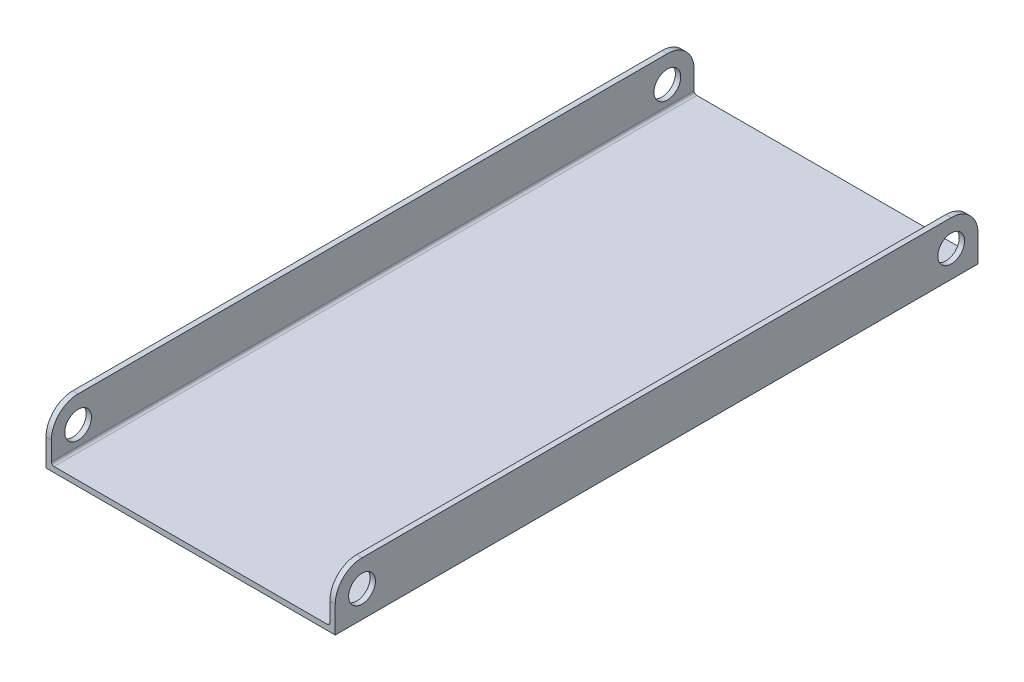
ISO-10303-21;
HEADER;
FILE_DESCRIPTION(('STEP AP214'),'2;1');
FILE_NAME('part.step','',(''),(''),'','','');
FILE_SCHEMA(('AUTOMOTIVE_DESIGN { 1 0 10303 214 1 1 1 1 }'));
ENDSEC;
DATA;
#1=APPLICATION_CONTEXT('core data for automotive mechanical design processes');
#2=APPLICATION_PROTOCOL_DEFINITION('international standard','automotive_design',2000,#1);
#3=PRODUCT_CONTEXT('',#1,'mechanical');
#4=PRODUCT('Part','Part','',(#3));
#5=PRODUCT_RELATED_PRODUCT_CATEGORY('part','',(#4));
#6=PRODUCT_DEFINITION_FORMATION('','',#4);
#7=PRODUCT_DEFINITION_CONTEXT('part definition',#1,'design');
#8=PRODUCT_DEFINITION('design','',#6,#7);
#9=PRODUCT_DEFINITION_SHAPE('','',#8);
#10=(LENGTH_UNIT() NAMED_UNIT(*) SI_UNIT(.MILLI.,.METRE.));
#11=(NAMED_UNIT(*) PLANE_ANGLE_UNIT() SI_UNIT($,.RADIAN.));
#12=(NAMED_UNIT(*) SI_UNIT($,.STERADIAN.) SOLID_ANGLE_UNIT());
#13=UNCERTAINTY_MEASURE_WITH_UNIT(LENGTH_MEASURE(1.E-05),#10,'distance_accuracy_value','');
#14=(GEOMETRIC_REPRESENTATION_CONTEXT(3) GLOBAL_UNCERTAINTY_ASSIGNED_CONTEXT((#13)) GLOBAL_UNIT_ASSIGNED_CONTEXT((#10,
#11,#12)) REPRESENTATION_CONTEXT('',''));
#15=CARTESIAN_POINT('',(0.,0.,0.));
#16=DIRECTION('',(0.,0.,1.));
#17=DIRECTION('',(1.,0.,0.));
#18=AXIS2_PLACEMENT_3D('',#15,#16,#17);
#19=CARTESIAN_POINT('',(0.,12.7,0.));
#20=DIRECTION('',(0.,-1.,0.));
#21=DIRECTION('',(0.,0.,-1.));
#22=AXIS2_PLACEMENT_3D('',#19,#20,#21);
#23=PLANE('',#22);
#24=DIRECTION('',(0.,0.,1.));
#25=VECTOR('',#24,1.);
#26=CARTESIAN_POINT('',(1.27,12.7,-152.4));
#27=LINE('',#26,#25);
#28=CARTESIAN_POINT('',(1.27,12.7,-146.05));
#29=VERTEX_POINT('',#28);
#30=CARTESIAN_POINT('',(1.27,12.7,-6.35000000000005));
#31=VERTEX_POINT('',#30);
#32=EDGE_CURVE('E178',#29,#31,#27,.T.);
#33=ORIENTED_EDGE('',*,*,#32,.F.);
#34=DIRECTION('',(-1.,0.,0.));
#35=VECTOR('',#34,1.);
#36=CARTESIAN_POINT('',(0.,12.7,-146.05));
#37=LINE('',#36,#35);
#38=CARTESIAN_POINT('',(0.,12.7,-146.05));
#39=VERTEX_POINT('',#38);
#40=EDGE_CURVE('E263',#29,#39,#37,.T.);
#41=ORIENTED_EDGE('',*,*,#40,.T.);
#42=DIRECTION('',(0.,0.,1.));
#43=VECTOR('',#42,1.);
#44=CARTESIAN_POINT('',(0.,12.7,0.));
#45=LINE('',#44,#43);
#46=CARTESIAN_POINT('',(0.,12.7,-6.35));
#47=VERTEX_POINT('',#46);
#48=EDGE_CURVE('E193',#39,#47,#45,.T.);
#49=ORIENTED_EDGE('',*,*,#48,.T.);
#50=DIRECTION('',(1.,0.,0.));
#51=VECTOR('',#50,1.);
#52=CARTESIAN_POINT('',(0.,12.7,-6.35));
#53=LINE('',#52,#51);
#54=EDGE_CURVE('E259',#47,#31,#53,.T.);
#55=ORIENTED_EDGE('',*,*,#54,.T.);
#56=EDGE_LOOP('',(#33,#41,#49,#55));
#57=FACE_BOUND('',#56,.T.);
#58=ADVANCED_FACE('F45',(#57),#23,.F.);
#59=CARTESIAN_POINT('',(0.,12.7,0.));
#60=DIRECTION('',(1.,0.,0.));
#61=DIRECTION('',(0.,0.,-1.));
#62=AXIS2_PLACEMENT_3D('',#59,#60,#61);
#63=PLANE('',#62);
#64=CARTESIAN_POINT('',(0.,6.35,-6.34999999999998));
#65=DIRECTION('',(1.,0.,0.));
#66=DIRECTION('',(0.,0.,-1.));
#67=AXIS2_PLACEMENT_3D('',#64,#65,#66);
#68=CIRCLE('',#67,3.175);
#69=CARTESIAN_POINT('',(0.,6.35,-9.52499999999998));
#70=VERTEX_POINT('',#69);
#71=EDGE_CURVE('E275',#70,#70,#68,.T.);
#72=ORIENTED_EDGE('',*,*,#71,.T.);
#73=EDGE_LOOP('',(#72));
#74=FACE_BOUND('',#73,.T.);
#75=CARTESIAN_POINT('',(0.,6.35,-146.05));
#76=DIRECTION('',(1.,0.,0.));
#77=DIRECTION('',(0.,0.,-1.));
#78=AXIS2_PLACEMENT_3D('',#75,#76,#77);
#79=CIRCLE('',#78,3.175);
#80=CARTESIAN_POINT('',(0.,6.35,-149.225));
#81=VERTEX_POINT('',#80);
#82=EDGE_CURVE('E295',#81,#81,#79,.T.);
#83=ORIENTED_EDGE('',*,*,#82,.T.);
#84=EDGE_LOOP('',(#83));
#85=FACE_BOUND('',#84,.T.);
#86=ORIENTED_EDGE('',*,*,#48,.F.);
#87=CARTESIAN_POINT('',(0.,6.35,-146.05));
#88=DIRECTION('',(1.,0.,0.));
#89=DIRECTION('',(0.,0.,-1.));
#90=AXIS2_PLACEMENT_3D('',#87,#88,#89);
#91=CIRCLE('',#90,6.35);
#92=CARTESIAN_POINT('',(0.,6.35,-152.4));
#93=VERTEX_POINT('',#92);
#94=EDGE_CURVE('E71',#39,#93,#91,.F.);
#95=ORIENTED_EDGE('',*,*,#94,.T.);
#96=DIRECTION('',(0.,-1.,0.));
#97=VECTOR('',#96,1.);
#98=CARTESIAN_POINT('',(0.,12.7,-152.4));
#99=LINE('',#98,#97);
#100=CARTESIAN_POINT('',(0.,0.,-152.4));
#101=VERTEX_POINT('',#100);
#102=EDGE_CURVE('E175',#93,#101,#99,.T.);
#103=ORIENTED_EDGE('',*,*,#102,.T.);
#104=DIRECTION('',(0.,0.,1.));
#105=VECTOR('',#104,1.);
#106=CARTESIAN_POINT('',(0.,0.,0.));
#107=LINE('',#106,#105);
#108=CARTESIAN_POINT('',(0.,0.,0.));
#109=VERTEX_POINT('',#108);
#110=EDGE_CURVE('E168',#101,#109,#107,.T.);
#111=ORIENTED_EDGE('',*,*,#110,.T.);
#112=DIRECTION('',(0.,-1.,0.));
#113=VECTOR('',#112,1.);
#114=CARTESIAN_POINT('',(0.,12.7,0.));
#115=LINE('',#114,#113);
#116=CARTESIAN_POINT('',(0.,6.35,0.));
#117=VERTEX_POINT('',#116);
#118=EDGE_CURVE('E150',#117,#109,#115,.T.);
#119=ORIENTED_EDGE('',*,*,#118,.F.);
#120=CARTESIAN_POINT('',(0.,6.35,-6.35));
#121=DIRECTION('',(1.,0.,0.));
#122=DIRECTION('',(0.,0.,-1.));
#123=AXIS2_PLACEMENT_3D('',#120,#121,#122);
#124=CIRCLE('',#123,6.35);
#125=EDGE_CURVE('E63',#117,#47,#124,.F.);
#126=ORIENTED_EDGE('',*,*,#125,.T.);
#127=EDGE_LOOP('',(#86,#95,#103,#111,#119,#126));
#128=FACE_BOUND('',#127,.T.);
#129=ADVANCED_FACE('F173',(#74,#85,#128),#63,.F.);
#130=CARTESIAN_POINT('',(0.,12.7,0.));
#131=DIRECTION('',(0.,0.,-1.));
#132=DIRECTION('',(-1.,0.,0.));
#133=AXIS2_PLACEMENT_3D('',#130,#131,#132);
#134=PLANE('',#133);
#135=DIRECTION('',(0.,-1.,0.));
#136=VECTOR('',#135,1.);
#137=CARTESIAN_POINT('',(68.58,12.7,0.));
#138=LINE('',#137,#136);
#139=CARTESIAN_POINT('',(68.58,6.35,0.));
#140=VERTEX_POINT('',#139);
#141=CARTESIAN_POINT('',(68.58,0.,0.));
#142=VERTEX_POINT('',#141);
#143=EDGE_CURVE('E162',#140,#142,#138,.T.);
#144=ORIENTED_EDGE('',*,*,#143,.F.);
#145=DIRECTION('',(1.,0.,0.));
#146=VECTOR('',#145,1.);
#147=CARTESIAN_POINT('',(0.,6.35,0.));
#148=LINE('',#147,#146);
#149=CARTESIAN_POINT('',(67.31,6.35,0.));
#150=VERTEX_POINT('',#149);
#151=EDGE_CURVE('E256',#140,#150,#148,.F.);
#152=ORIENTED_EDGE('',*,*,#151,.T.);
#153=DIRECTION('',(0.,1.,0.));
#154=VECTOR('',#153,1.);
#155=CARTESIAN_POINT('',(67.31,12.7,0.));
#156=LINE('',#155,#154);
#157=CARTESIAN_POINT('',(67.31,1.90500000000001,0.));
#158=VERTEX_POINT('',#157);
#159=EDGE_CURVE('E308',#158,#150,#156,.T.);
#160=ORIENTED_EDGE('',*,*,#159,.F.);
#161=CARTESIAN_POINT('',(66.675,1.90500000000001,0.));
#162=DIRECTION('',(0.,0.,-1.));
#163=DIRECTION('',(-1.,0.,0.));
#164=AXIS2_PLACEMENT_3D('',#161,#162,#163);
#165=CIRCLE('',#164,0.635);
#166=CARTESIAN_POINT('',(66.675,1.27000000000001,0.));
#167=VERTEX_POINT('',#166);
#168=EDGE_CURVE('E215',#158,#167,#165,.T.);
#169=ORIENTED_EDGE('',*,*,#168,.T.);
#170=DIRECTION('',(1.,0.,0.));
#171=VECTOR('',#170,1.);
#172=CARTESIAN_POINT('',(1.26999999999999,1.27,0.));
#173=LINE('',#172,#171);
#174=CARTESIAN_POINT('',(1.90499999999999,1.27,0.));
#175=VERTEX_POINT('',#174);
#176=EDGE_CURVE('E318',#175,#167,#173,.T.);
#177=ORIENTED_EDGE('',*,*,#176,.F.);
#178=CARTESIAN_POINT('',(1.90499999999999,1.905,0.));
#179=DIRECTION('',(0.,0.,-1.));
#180=DIRECTION('',(-1.,0.,0.));
#181=AXIS2_PLACEMENT_3D('',#178,#179,#180);
#182=CIRCLE('',#181,0.635);
#183=CARTESIAN_POINT('',(1.26999999999999,1.905,0.));
#184=VERTEX_POINT('',#183);
#185=EDGE_CURVE('E221',#175,#184,#182,.T.);
#186=ORIENTED_EDGE('',*,*,#185,.T.);
#187=DIRECTION('',(0.,-1.,0.));
#188=VECTOR('',#187,1.);
#189=CARTESIAN_POINT('',(1.27,12.7,0.));
#190=LINE('',#189,#188);
#191=CARTESIAN_POINT('',(1.27,6.35,0.));
#192=VERTEX_POINT('',#191);
#193=EDGE_CURVE('E303',#192,#184,#190,.T.);
#194=ORIENTED_EDGE('',*,*,#193,.F.);
#195=DIRECTION('',(1.,0.,0.));
#196=VECTOR('',#195,1.);
#197=CARTESIAN_POINT('',(0.,6.35,0.));
#198=LINE('',#197,#196);
#199=EDGE_CURVE('E158',#192,#117,#198,.F.);
#200=ORIENTED_EDGE('',*,*,#199,.T.);
#201=ORIENTED_EDGE('',*,*,#118,.T.);
#202=DIRECTION('',(1.,0.,0.));
#203=VECTOR('',#202,1.);
#204=CARTESIAN_POINT('',(0.,0.,0.));
#205=LINE('',#204,#203);
#206=EDGE_CURVE('E154',#109,#142,#205,.T.);
#207=ORIENTED_EDGE('',*,*,#206,.T.);
#208=EDGE_LOOP('',(#144,#152,#160,#169,#177,#186,#194,#200,#201,#207));
#209=FACE_BOUND('',#208,.T.);
#210=ADVANCED_FACE('F153',(#209),#134,.F.);
#211=CARTESIAN_POINT('',(68.58,12.7,0.));
#212=DIRECTION('',(-1.,0.,0.));
#213=DIRECTION('',(0.,0.,1.));
#214=AXIS2_PLACEMENT_3D('',#211,#212,#213);
#215=PLANE('',#214);
#216=CARTESIAN_POINT('',(68.58,6.35,-6.35));
#217=DIRECTION('',(1.,0.,0.));
#218=DIRECTION('',(0.,0.,-1.));
#219=AXIS2_PLACEMENT_3D('',#216,#217,#218);
#220=CIRCLE('',#219,3.175);
#221=CARTESIAN_POINT('',(68.58,6.35,-9.525));
#222=VERTEX_POINT('',#221);
#223=EDGE_CURVE('E283',#222,#222,#220,.T.);
#224=ORIENTED_EDGE('',*,*,#223,.F.);
#225=EDGE_LOOP('',(#224));
#226=FACE_BOUND('',#225,.T.);
#227=CARTESIAN_POINT('',(68.58,6.35,-146.05));
#228=DIRECTION('',(1.,0.,0.));
#229=DIRECTION('',(0.,0.,-1.));
#230=AXIS2_PLACEMENT_3D('',#227,#228,#229);
#231=CIRCLE('',#230,3.175);
#232=CARTESIAN_POINT('',(68.58,6.35,-149.225));
#233=VERTEX_POINT('',#232);
#234=EDGE_CURVE('E289',#233,#233,#231,.T.);
#235=ORIENTED_EDGE('',*,*,#234,.F.);
#236=EDGE_LOOP('',(#235));
#237=FACE_BOUND('',#236,.T.);
#238=DIRECTION('',(0.,-1.,0.));
#239=VECTOR('',#238,1.);
#240=CARTESIAN_POINT('',(68.58,12.7,-152.4));
#241=LINE('',#240,#239);
#242=CARTESIAN_POINT('',(68.58,6.35,-152.4));
#243=VERTEX_POINT('',#242);
#244=CARTESIAN_POINT('',(68.58,0.,-152.4));
#245=VERTEX_POINT('',#244);
#246=EDGE_CURVE('E196',#243,#245,#241,.T.);
#247=ORIENTED_EDGE('',*,*,#246,.F.);
#248=CARTESIAN_POINT('',(68.58,6.35,-146.05));
#249=DIRECTION('',(-1.,0.,0.));
#250=DIRECTION('',(0.,0.,1.));
#251=AXIS2_PLACEMENT_3D('',#248,#249,#250);
#252=CIRCLE('',#251,6.35);
#253=CARTESIAN_POINT('',(68.58,12.7,-146.05));
#254=VERTEX_POINT('',#253);
#255=EDGE_CURVE('E251',#243,#254,#252,.F.);
#256=ORIENTED_EDGE('',*,*,#255,.T.);
#257=DIRECTION('',(0.,0.,-1.));
#258=VECTOR('',#257,1.);
#259=CARTESIAN_POINT('',(68.58,12.7,0.));
#260=LINE('',#259,#258);
#261=CARTESIAN_POINT('',(68.58,12.7,-6.35));
#262=VERTEX_POINT('',#261);
#263=EDGE_CURVE('E185',#262,#254,#260,.T.);
#264=ORIENTED_EDGE('',*,*,#263,.F.);
#265=CARTESIAN_POINT('',(68.58,6.35,-6.35));
#266=DIRECTION('',(-1.,0.,0.));
#267=DIRECTION('',(0.,0.,1.));
#268=AXIS2_PLACEMENT_3D('',#265,#266,#267);
#269=CIRCLE('',#268,6.35);
#270=EDGE_CURVE('E248',#262,#140,#269,.F.);
#271=ORIENTED_EDGE('',*,*,#270,.T.);
#272=ORIENTED_EDGE('',*,*,#143,.T.);
#273=DIRECTION('',(0.,0.,-1.));
#274=VECTOR('',#273,1.);
#275=CARTESIAN_POINT('',(68.58,0.,0.));
#276=LINE('',#275,#274);
#277=EDGE_CURVE('E170',#142,#245,#276,.T.);
#278=ORIENTED_EDGE('',*,*,#277,.T.);
#279=EDGE_LOOP('',(#247,#256,#264,#271,#272,#278));
#280=FACE_BOUND('',#279,.T.);
#281=ADVANCED_FACE('F361',(#226,#237,#280),#215,.F.);
#282=CARTESIAN_POINT('',(0.,12.7,-152.4));
#283=DIRECTION('',(0.,0.,1.));
#284=DIRECTION('',(1.,0.,0.));
#285=AXIS2_PLACEMENT_3D('',#282,#283,#284);
#286=PLANE('',#285);
#287=DIRECTION('',(0.,1.,0.));
#288=VECTOR('',#287,1.);
#289=CARTESIAN_POINT('',(67.31,12.7,-152.4));
#290=LINE('',#289,#288);
#291=CARTESIAN_POINT('',(67.31,1.90500000000001,-152.4));
#292=VERTEX_POINT('',#291);
#293=CARTESIAN_POINT('',(67.31,6.35,-152.4));
#294=VERTEX_POINT('',#293);
#295=EDGE_CURVE('E312',#292,#294,#290,.T.);
#296=ORIENTED_EDGE('',*,*,#295,.T.);
#297=DIRECTION('',(-1.,0.,0.));
#298=VECTOR('',#297,1.);
#299=CARTESIAN_POINT('',(0.,6.35,-152.4));
#300=LINE('',#299,#298);
#301=EDGE_CURVE('E245',#294,#243,#300,.F.);
#302=ORIENTED_EDGE('',*,*,#301,.T.);
#303=ORIENTED_EDGE('',*,*,#246,.T.);
#304=DIRECTION('',(-1.,0.,0.));
#305=VECTOR('',#304,1.);
#306=CARTESIAN_POINT('',(0.,0.,-152.4));
#307=LINE('',#306,#305);
#308=EDGE_CURVE('E190',#245,#101,#307,.T.);
#309=ORIENTED_EDGE('',*,*,#308,.T.);
#310=ORIENTED_EDGE('',*,*,#102,.F.);
#311=DIRECTION('',(-1.,0.,0.));
#312=VECTOR('',#311,1.);
#313=CARTESIAN_POINT('',(0.,6.35,-152.4));
#314=LINE('',#313,#312);
#315=CARTESIAN_POINT('',(1.27,6.35,-152.4));
#316=VERTEX_POINT('',#315);
#317=EDGE_CURVE('E242',#93,#316,#314,.F.);
#318=ORIENTED_EDGE('',*,*,#317,.T.);
#319=DIRECTION('',(0.,-1.,0.));
#320=VECTOR('',#319,1.);
#321=CARTESIAN_POINT('',(1.27,12.7,-152.4));
#322=LINE('',#321,#320);
#323=CARTESIAN_POINT('',(1.26999999999999,1.905,-152.4));
#324=VERTEX_POINT('',#323);
#325=EDGE_CURVE('E304',#316,#324,#322,.T.);
#326=ORIENTED_EDGE('',*,*,#325,.T.);
#327=CARTESIAN_POINT('',(1.90499999999999,1.905,-152.4));
#328=DIRECTION('',(0.,0.,1.));
#329=DIRECTION('',(1.,0.,0.));
#330=AXIS2_PLACEMENT_3D('',#327,#328,#329);
#331=CIRCLE('',#330,0.635);
#332=CARTESIAN_POINT('',(1.90499999999999,1.27,-152.4));
#333=VERTEX_POINT('',#332);
#334=EDGE_CURVE('E225',#324,#333,#331,.T.);
#335=ORIENTED_EDGE('',*,*,#334,.T.);
#336=DIRECTION('',(1.,0.,0.));
#337=VECTOR('',#336,1.);
#338=CARTESIAN_POINT('',(1.26999999999999,1.27,-152.4));
#339=LINE('',#338,#337);
#340=CARTESIAN_POINT('',(66.675,1.27000000000001,-152.4));
#341=VERTEX_POINT('',#340);
#342=EDGE_CURVE('E307',#333,#341,#339,.T.);
#343=ORIENTED_EDGE('',*,*,#342,.T.);
#344=CARTESIAN_POINT('',(66.675,1.90500000000001,-152.4));
#345=DIRECTION('',(0.,0.,1.));
#346=DIRECTION('',(1.,0.,0.));
#347=AXIS2_PLACEMENT_3D('',#344,#345,#346);
#348=CIRCLE('',#347,0.635);
#349=EDGE_CURVE('E218',#341,#292,#348,.T.);
#350=ORIENTED_EDGE('',*,*,#349,.T.);
#351=EDGE_LOOP('',(#296,#302,#303,#309,#310,#318,#326,#335,#343,#350));
#352=FACE_BOUND('',#351,.T.);
#353=ADVANCED_FACE('F348',(#352),#286,.F.);
#354=ORIENTED_EDGE('',*,*,#263,.T.);
#355=DIRECTION('',(-1.,0.,0.));
#356=VECTOR('',#355,1.);
#357=CARTESIAN_POINT('',(0.,12.7,-146.05));
#358=LINE('',#357,#356);
#359=CARTESIAN_POINT('',(67.31,12.7,-146.05));
#360=VERTEX_POINT('',#359);
#361=EDGE_CURVE('E232',#254,#360,#358,.T.);
#362=ORIENTED_EDGE('',*,*,#361,.T.);
#363=DIRECTION('',(0.,0.,1.));
#364=VECTOR('',#363,1.);
#365=CARTESIAN_POINT('',(67.31,12.7,-152.4));
#366=LINE('',#365,#364);
#367=CARTESIAN_POINT('',(67.31,12.7,-6.35000000000005));
#368=VERTEX_POINT('',#367);
#369=EDGE_CURVE('E182',#360,#368,#366,.T.);
#370=ORIENTED_EDGE('',*,*,#369,.T.);
#371=DIRECTION('',(1.,0.,0.));
#372=VECTOR('',#371,1.);
#373=CARTESIAN_POINT('',(0.,12.7,-6.35));
#374=LINE('',#373,#372);
#375=EDGE_CURVE('E228',#368,#262,#374,.T.);
#376=ORIENTED_EDGE('',*,*,#375,.T.);
#377=EDGE_LOOP('',(#354,#362,#370,#376));
#378=FACE_BOUND('',#377,.T.);
#379=ADVANCED_FACE('F335',(#378),#23,.F.);
#380=CARTESIAN_POINT('',(0.,0.,0.));
#381=DIRECTION('',(0.,-1.,0.));
#382=DIRECTION('',(0.,0.,-1.));
#383=AXIS2_PLACEMENT_3D('',#380,#381,#382);
#384=PLANE('',#383);
#385=ORIENTED_EDGE('',*,*,#110,.F.);
#386=ORIENTED_EDGE('',*,*,#308,.F.);
#387=ORIENTED_EDGE('',*,*,#277,.F.);
#388=ORIENTED_EDGE('',*,*,#206,.F.);
#389=EDGE_LOOP('',(#385,#386,#387,#388));
#390=FACE_BOUND('',#389,.T.);
#391=ADVANCED_FACE('F166',(#390),#384,.T.);
#392=CARTESIAN_POINT('',(1.27,12.7,-152.4));
#393=DIRECTION('',(-1.,0.,0.));
#394=DIRECTION('',(0.,-1.,0.));
#395=AXIS2_PLACEMENT_3D('',#392,#393,#394);
#396=PLANE('',#395);
#397=CARTESIAN_POINT('',(1.27,6.35,-6.34999999999998));
#398=DIRECTION('',(-1.,0.,0.));
#399=DIRECTION('',(0.,-1.,0.));
#400=AXIS2_PLACEMENT_3D('',#397,#398,#399);
#401=CIRCLE('',#400,3.175);
#402=CARTESIAN_POINT('',(1.27,3.175,-6.34999999999998));
#403=VERTEX_POINT('',#402);
#404=EDGE_CURVE('E299',#403,#403,#401,.T.);
#405=ORIENTED_EDGE('',*,*,#404,.T.);
#406=EDGE_LOOP('',(#405));
#407=FACE_BOUND('',#406,.T.);
#408=CARTESIAN_POINT('',(1.27,6.35,-146.05));
#409=DIRECTION('',(-1.,0.,0.));
#410=DIRECTION('',(0.,-1.,0.));
#411=AXIS2_PLACEMENT_3D('',#408,#409,#410);
#412=CIRCLE('',#411,3.175);
#413=CARTESIAN_POINT('',(1.27,3.175,-146.05));
#414=VERTEX_POINT('',#413);
#415=EDGE_CURVE('E274',#414,#414,#412,.T.);
#416=ORIENTED_EDGE('',*,*,#415,.T.);
#417=EDGE_LOOP('',(#416));
#418=FACE_BOUND('',#417,.T.);
#419=ORIENTED_EDGE('',*,*,#325,.F.);
#420=CARTESIAN_POINT('',(1.27,6.35,-146.05));
#421=DIRECTION('',(-1.,0.,0.));
#422=DIRECTION('',(0.,-1.,0.));
#423=AXIS2_PLACEMENT_3D('',#420,#421,#422);
#424=CIRCLE('',#423,6.35);
#425=EDGE_CURVE('E11',#316,#29,#424,.F.);
#426=ORIENTED_EDGE('',*,*,#425,.T.);
#427=ORIENTED_EDGE('',*,*,#32,.T.);
#428=CARTESIAN_POINT('',(1.27,6.35,-6.35));
#429=DIRECTION('',(-1.,0.,0.));
#430=DIRECTION('',(0.,-1.,0.));
#431=AXIS2_PLACEMENT_3D('',#428,#429,#430);
#432=CIRCLE('',#431,6.35);
#433=EDGE_CURVE('E55',#31,#192,#432,.F.);
#434=ORIENTED_EDGE('',*,*,#433,.T.);
#435=ORIENTED_EDGE('',*,*,#193,.T.);
#436=DIRECTION('',(0.,0.,1.));
#437=VECTOR('',#436,1.);
#438=CARTESIAN_POINT('',(1.26999999999999,1.905,-152.4));
#439=LINE('',#438,#437);
#440=EDGE_CURVE('E211',#184,#324,#439,.F.);
#441=ORIENTED_EDGE('',*,*,#440,.T.);
#442=EDGE_LOOP('',(#419,#426,#427,#434,#435,#441));
#443=FACE_BOUND('',#442,.T.);
#444=ADVANCED_FACE('F367',(#407,#418,#443),#396,.F.);
#445=CARTESIAN_POINT('',(67.31,12.7,-152.4));
#446=DIRECTION('',(1.,0.,0.));
#447=DIRECTION('',(0.,1.,0.));
#448=AXIS2_PLACEMENT_3D('',#445,#446,#447);
#449=PLANE('',#448);
#450=CARTESIAN_POINT('',(67.31,6.35,-6.35));
#451=DIRECTION('',(1.,0.,0.));
#452=DIRECTION('',(0.,1.,0.));
#453=AXIS2_PLACEMENT_3D('',#450,#451,#452);
#454=CIRCLE('',#453,3.175);
#455=CARTESIAN_POINT('',(67.31,9.525,-6.35));
#456=VERTEX_POINT('',#455);
#457=EDGE_CURVE('E49',#456,#456,#454,.T.);
#458=ORIENTED_EDGE('',*,*,#457,.T.);
#459=EDGE_LOOP('',(#458));
#460=FACE_BOUND('',#459,.T.);
#461=CARTESIAN_POINT('',(67.31,6.35,-146.05));
#462=DIRECTION('',(1.,0.,0.));
#463=DIRECTION('',(0.,1.,0.));
#464=AXIS2_PLACEMENT_3D('',#461,#462,#463);
#465=CIRCLE('',#464,3.175);
#466=CARTESIAN_POINT('',(67.31,9.525,-146.05));
#467=VERTEX_POINT('',#466);
#468=EDGE_CURVE('E271',#467,#467,#465,.T.);
#469=ORIENTED_EDGE('',*,*,#468,.T.);
#470=EDGE_LOOP('',(#469));
#471=FACE_BOUND('',#470,.T.);
#472=ORIENTED_EDGE('',*,*,#369,.F.);
#473=CARTESIAN_POINT('',(67.31,6.35,-146.05));
#474=DIRECTION('',(1.,0.,0.));
#475=DIRECTION('',(0.,1.,0.));
#476=AXIS2_PLACEMENT_3D('',#473,#474,#475);
#477=CIRCLE('',#476,6.35);
#478=EDGE_CURVE('E239',#360,#294,#477,.F.);
#479=ORIENTED_EDGE('',*,*,#478,.T.);
#480=ORIENTED_EDGE('',*,*,#295,.F.);
#481=DIRECTION('',(0.,0.,1.));
#482=VECTOR('',#481,1.);
#483=CARTESIAN_POINT('',(67.31,1.90500000000001,0.));
#484=LINE('',#483,#482);
#485=EDGE_CURVE('E161',#292,#158,#484,.T.);
#486=ORIENTED_EDGE('',*,*,#485,.T.);
#487=ORIENTED_EDGE('',*,*,#159,.T.);
#488=CARTESIAN_POINT('',(67.31,6.35,-6.35));
#489=DIRECTION('',(1.,0.,0.));
#490=DIRECTION('',(0.,1.,0.));
#491=AXIS2_PLACEMENT_3D('',#488,#489,#490);
#492=CIRCLE('',#491,6.35);
#493=EDGE_CURVE('E236',#150,#368,#492,.F.);
#494=ORIENTED_EDGE('',*,*,#493,.T.);
#495=EDGE_LOOP('',(#472,#479,#480,#486,#487,#494));
#496=FACE_BOUND('',#495,.T.);
#497=ADVANCED_FACE('F345',(#460,#471,#496),#449,.F.);
#498=CARTESIAN_POINT('',(1.26999999999999,1.27,-152.4));
#499=DIRECTION('',(0.,-1.,0.));
#500=DIRECTION('',(1.,0.,0.));
#501=AXIS2_PLACEMENT_3D('',#498,#499,#500);
#502=PLANE('',#501);
#503=ORIENTED_EDGE('',*,*,#176,.T.);
#504=DIRECTION('',(0.,0.,1.));
#505=VECTOR('',#504,1.);
#506=CARTESIAN_POINT('',(66.675,1.27000000000001,-152.4));
#507=LINE('',#506,#505);
#508=EDGE_CURVE('E208',#167,#341,#507,.F.);
#509=ORIENTED_EDGE('',*,*,#508,.T.);
#510=ORIENTED_EDGE('',*,*,#342,.F.);
#511=DIRECTION('',(0.,0.,1.));
#512=VECTOR('',#511,1.);
#513=CARTESIAN_POINT('',(1.90499999999999,1.27,0.));
#514=LINE('',#513,#512);
#515=EDGE_CURVE('E204',#333,#175,#514,.T.);
#516=ORIENTED_EDGE('',*,*,#515,.T.);
#517=EDGE_LOOP('',(#503,#509,#510,#516));
#518=FACE_BOUND('',#517,.T.);
#519=ADVANCED_FACE('F375',(#518),#502,.F.);
#520=CARTESIAN_POINT('',(66.675,1.90500000000001,-152.4));
#521=DIRECTION('',(0.,0.,-1.));
#522=DIRECTION('',(-1.,0.,0.));
#523=AXIS2_PLACEMENT_3D('',#520,#521,#522);
#524=CYLINDRICAL_SURFACE('',#523,0.635);
#525=ORIENTED_EDGE('',*,*,#349,.F.);
#526=ORIENTED_EDGE('',*,*,#508,.F.);
#527=ORIENTED_EDGE('',*,*,#168,.F.);
#528=ORIENTED_EDGE('',*,*,#485,.F.);
#529=EDGE_LOOP('',(#525,#526,#527,#528));
#530=FACE_BOUND('',#529,.T.);
#531=ADVANCED_FACE('F354',(#530),#524,.F.);
#532=CARTESIAN_POINT('',(1.90499999999999,1.905,-152.4));
#533=DIRECTION('',(0.,0.,-1.));
#534=DIRECTION('',(-1.,0.,0.));
#535=AXIS2_PLACEMENT_3D('',#532,#533,#534);
#536=CYLINDRICAL_SURFACE('',#535,0.635);
#537=ORIENTED_EDGE('',*,*,#334,.F.);
#538=ORIENTED_EDGE('',*,*,#440,.F.);
#539=ORIENTED_EDGE('',*,*,#185,.F.);
#540=ORIENTED_EDGE('',*,*,#515,.F.);
#541=EDGE_LOOP('',(#537,#538,#539,#540));
#542=FACE_BOUND('',#541,.T.);
#543=ADVANCED_FACE('F373',(#542),#536,.F.);
#544=CARTESIAN_POINT('',(0.,6.35,-146.05));
#545=DIRECTION('',(-1.,0.,0.));
#546=DIRECTION('',(0.,0.,1.));
#547=AXIS2_PLACEMENT_3D('',#544,#545,#546);
#548=CYLINDRICAL_SURFACE('',#547,6.35);
#549=ORIENTED_EDGE('',*,*,#255,.F.);
#550=ORIENTED_EDGE('',*,*,#301,.F.);
#551=ORIENTED_EDGE('',*,*,#478,.F.);
#552=ORIENTED_EDGE('',*,*,#361,.F.);
#553=EDGE_LOOP('',(#549,#550,#551,#552));
#554=FACE_BOUND('',#553,.T.);
#555=ADVANCED_FACE('F341',(#554),#548,.T.);
#556=CARTESIAN_POINT('',(0.,6.35,-6.35));
#557=DIRECTION('',(1.,0.,0.));
#558=DIRECTION('',(0.,0.,-1.));
#559=AXIS2_PLACEMENT_3D('',#556,#557,#558);
#560=CYLINDRICAL_SURFACE('',#559,6.35);
#561=ORIENTED_EDGE('',*,*,#493,.F.);
#562=ORIENTED_EDGE('',*,*,#151,.F.);
#563=ORIENTED_EDGE('',*,*,#270,.F.);
#564=ORIENTED_EDGE('',*,*,#375,.F.);
#565=EDGE_LOOP('',(#561,#562,#563,#564));
#566=FACE_BOUND('',#565,.T.);
#567=ADVANCED_FACE('F360',(#566),#560,.T.);
#568=CARTESIAN_POINT('',(0.,6.35,-146.05));
#569=DIRECTION('',(-1.,0.,0.));
#570=DIRECTION('',(0.,0.,1.));
#571=AXIS2_PLACEMENT_3D('',#568,#569,#570);
#572=CYLINDRICAL_SURFACE('',#571,6.35);
#573=ORIENTED_EDGE('',*,*,#425,.F.);
#574=ORIENTED_EDGE('',*,*,#317,.F.);
#575=ORIENTED_EDGE('',*,*,#94,.F.);
#576=ORIENTED_EDGE('',*,*,#40,.F.);
#577=EDGE_LOOP('',(#573,#574,#575,#576));
#578=FACE_BOUND('',#577,.T.);
#579=ADVANCED_FACE('F364',(#578),#572,.T.);
#580=CARTESIAN_POINT('',(0.,6.35,-6.35));
#581=DIRECTION('',(1.,0.,0.));
#582=DIRECTION('',(0.,0.,-1.));
#583=AXIS2_PLACEMENT_3D('',#580,#581,#582);
#584=CYLINDRICAL_SURFACE('',#583,6.35);
#585=ORIENTED_EDGE('',*,*,#125,.F.);
#586=ORIENTED_EDGE('',*,*,#199,.F.);
#587=ORIENTED_EDGE('',*,*,#433,.F.);
#588=ORIENTED_EDGE('',*,*,#54,.F.);
#589=EDGE_LOOP('',(#585,#586,#587,#588));
#590=FACE_BOUND('',#589,.T.);
#591=ADVANCED_FACE('F47',(#590),#584,.T.);
#592=CARTESIAN_POINT('',(0.,6.35,-146.05));
#593=DIRECTION('',(1.,0.,0.));
#594=DIRECTION('',(0.,0.,-1.));
#595=AXIS2_PLACEMENT_3D('',#592,#593,#594);
#596=CYLINDRICAL_SURFACE('',#595,3.175);
#597=ORIENTED_EDGE('',*,*,#234,.T.);
#598=EDGE_LOOP('',(#597));
#599=FACE_BOUND('',#598,.T.);
#600=ORIENTED_EDGE('',*,*,#468,.F.);
#601=EDGE_LOOP('',(#600));
#602=FACE_BOUND('',#601,.T.);
#603=ADVANCED_FACE('F416',(#599,#602),#596,.F.);
#604=CARTESIAN_POINT('',(0.,6.35,-6.34999999999998));
#605=DIRECTION('',(1.,0.,0.));
#606=DIRECTION('',(0.,0.,-1.));
#607=AXIS2_PLACEMENT_3D('',#604,#605,#606);
#608=CYLINDRICAL_SURFACE('',#607,3.175);
#609=ORIENTED_EDGE('',*,*,#223,.T.);
#610=EDGE_LOOP('',(#609));
#611=FACE_BOUND('',#610,.T.);
#612=ORIENTED_EDGE('',*,*,#457,.F.);
#613=EDGE_LOOP('',(#612));
#614=FACE_BOUND('',#613,.T.);
#615=ADVANCED_FACE('F420',(#611,#614),#608,.F.);
#616=ORIENTED_EDGE('',*,*,#82,.F.);
#617=EDGE_LOOP('',(#616));
#618=FACE_BOUND('',#617,.T.);
#619=ORIENTED_EDGE('',*,*,#415,.F.);
#620=EDGE_LOOP('',(#619));
#621=FACE_BOUND('',#620,.T.);
#622=ADVANCED_FACE('F423',(#618,#621),#596,.F.);
#623=ORIENTED_EDGE('',*,*,#71,.F.);
#624=EDGE_LOOP('',(#623));
#625=FACE_BOUND('',#624,.T.);
#626=ORIENTED_EDGE('',*,*,#404,.F.);
#627=EDGE_LOOP('',(#626));
#628=FACE_BOUND('',#627,.T.);
#629=ADVANCED_FACE('F429',(#625,#628),#608,.F.);
#630=CLOSED_SHELL('',(#58,#129,#210,#281,#353,#379,#391,#444,#497,#519,#531,#543,#555,#567,#579,
#591,#603,#615,#622,#629));
#631=MANIFOLD_SOLID_BREP('B2',#630);
#632=ADVANCED_BREP_SHAPE_REPRESENTATION('',(#18,#631),#14);
#633=SHAPE_DEFINITION_REPRESENTATION(#9,#632);
ENDSEC;
END-ISO-10303-21;
